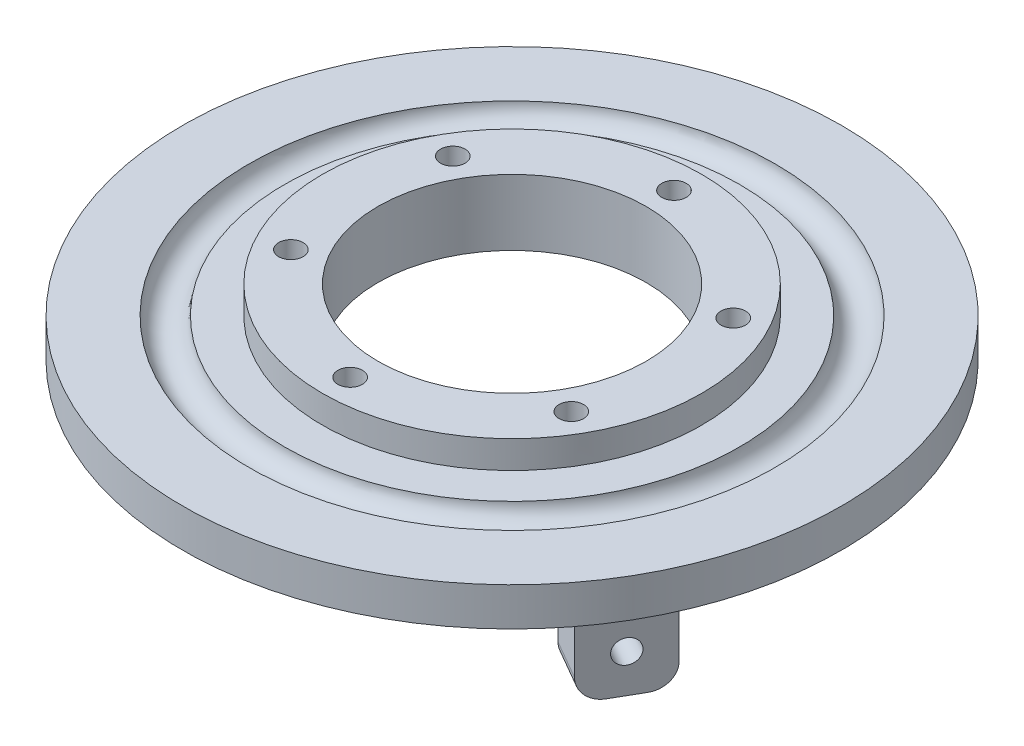
ISO-10303-21;
HEADER;
FILE_DESCRIPTION(('STEP AP214'),'2;1');
FILE_NAME('part.step','',(''),(''),'','','');
FILE_SCHEMA(('AUTOMOTIVE_DESIGN { 1 0 10303 214 1 1 1 1 }'));
ENDSEC;
DATA;
#1=APPLICATION_CONTEXT('core data for automotive mechanical design processes');
#2=APPLICATION_PROTOCOL_DEFINITION('international standard','automotive_design',2000,#1);
#3=PRODUCT_CONTEXT('',#1,'mechanical');
#4=PRODUCT('Part','Part','',(#3));
#5=PRODUCT_RELATED_PRODUCT_CATEGORY('part','',(#4));
#6=PRODUCT_DEFINITION_FORMATION('','',#4);
#7=PRODUCT_DEFINITION_CONTEXT('part definition',#1,'design');
#8=PRODUCT_DEFINITION('design','',#6,#7);
#9=PRODUCT_DEFINITION_SHAPE('','',#8);
#10=(LENGTH_UNIT() NAMED_UNIT(*) SI_UNIT(.MILLI.,.METRE.));
#11=(NAMED_UNIT(*) PLANE_ANGLE_UNIT() SI_UNIT($,.RADIAN.));
#12=(NAMED_UNIT(*) SI_UNIT($,.STERADIAN.) SOLID_ANGLE_UNIT());
#13=UNCERTAINTY_MEASURE_WITH_UNIT(LENGTH_MEASURE(1.E-05),#10,'distance_accuracy_value','');
#14=(GEOMETRIC_REPRESENTATION_CONTEXT(3) GLOBAL_UNCERTAINTY_ASSIGNED_CONTEXT((#13)) GLOBAL_UNIT_ASSIGNED_CONTEXT((#10,
#11,#12)) REPRESENTATION_CONTEXT('',''));
#15=CARTESIAN_POINT('',(0.,0.,0.));
#16=DIRECTION('',(0.,0.,1.));
#17=DIRECTION('',(1.,0.,0.));
#18=AXIS2_PLACEMENT_3D('',#15,#16,#17);
#19=CARTESIAN_POINT('',(0.,5.,0.));
#20=DIRECTION('',(0.,-1.,0.));
#21=DIRECTION('',(0.,0.,-1.));
#22=AXIS2_PLACEMENT_3D('',#19,#20,#21);
#23=PLANE('',#22);
#24=CARTESIAN_POINT('',(0.,5.,0.));
#25=DIRECTION('',(0.,-1.,0.));
#26=DIRECTION('',(0.,0.,-1.));
#27=AXIS2_PLACEMENT_3D('',#24,#25,#26);
#28=CIRCLE('',#27,24.75);
#29=CARTESIAN_POINT('',(0.,5.,-24.75));
#30=VERTEX_POINT('',#29);
#31=EDGE_CURVE('E350',#30,#30,#28,.F.);
#32=ORIENTED_EDGE('',*,*,#31,.F.);
#33=EDGE_LOOP('',(#32));
#34=FACE_BOUND('',#33,.T.);
#35=CARTESIAN_POINT('',(0.,5.,0.));
#36=DIRECTION('',(0.,-1.,0.));
#37=DIRECTION('',(0.,0.,-1.));
#38=AXIS2_PLACEMENT_3D('',#35,#36,#37);
#39=CIRCLE('',#38,29.6771515331387);
#40=CARTESIAN_POINT('',(0.,5.,-29.6771515331387));
#41=VERTEX_POINT('',#40);
#42=EDGE_CURVE('E346',#41,#41,#39,.T.);
#43=ORIENTED_EDGE('',*,*,#42,.F.);
#44=EDGE_LOOP('',(#43));
#45=FACE_BOUND('',#44,.T.);
#46=ADVANCED_FACE('F45',(#34,#45),#23,.F.);
#47=CARTESIAN_POINT('',(0.,5.1,0.));
#48=DIRECTION('',(0.,-1.,0.));
#49=DIRECTION('',(0.,0.,-1.));
#50=AXIS2_PLACEMENT_3D('',#47,#48,#49);
#51=TOROIDAL_SURFACE('',#50,32.,2.325);
#52=CARTESIAN_POINT('',(0.,5.,0.));
#53=DIRECTION('',(0.,-1.,0.));
#54=DIRECTION('',(0.,0.,-1.));
#55=AXIS2_PLACEMENT_3D('',#52,#53,#54);
#56=CIRCLE('',#55,34.3228484668613);
#57=CARTESIAN_POINT('',(0.,5.,-34.3228484668613));
#58=VERTEX_POINT('',#57);
#59=EDGE_CURVE('E342',#58,#58,#56,.T.);
#60=ORIENTED_EDGE('',*,*,#59,.F.);
#61=EDGE_LOOP('',(#60));
#62=FACE_BOUND('',#61,.T.);
#63=ORIENTED_EDGE('',*,*,#42,.T.);
#64=EDGE_LOOP('',(#63));
#65=FACE_BOUND('',#64,.T.);
#66=ADVANCED_FACE('F499',(#62,#65),#51,.F.);
#67=CARTESIAN_POINT('',(-34.3228484668613,5.,0.));
#68=DIRECTION('',(0.,-1.,0.));
#69=DIRECTION('',(0.,0.,-1.));
#70=AXIS2_PLACEMENT_3D('',#67,#68,#69);
#71=PLANE('',#70);
#72=CARTESIAN_POINT('',(0.,4.99999999999999,0.));
#73=DIRECTION('',(0.,-1.,0.));
#74=DIRECTION('',(0.,0.,-1.));
#75=AXIS2_PLACEMENT_3D('',#72,#73,#74);
#76=CIRCLE('',#75,43.);
#77=CARTESIAN_POINT('',(0.,4.99999999999999,-43.));
#78=VERTEX_POINT('',#77);
#79=EDGE_CURVE('E338',#78,#78,#76,.T.);
#80=ORIENTED_EDGE('',*,*,#79,.F.);
#81=EDGE_LOOP('',(#80));
#82=FACE_BOUND('',#81,.T.);
#83=ORIENTED_EDGE('',*,*,#59,.T.);
#84=EDGE_LOOP('',(#83));
#85=FACE_BOUND('',#84,.T.);
#86=ADVANCED_FACE('F507',(#82,#85),#71,.F.);
#87=CARTESIAN_POINT('',(0.,0.,0.));
#88=DIRECTION('',(0.,-1.,0.));
#89=DIRECTION('',(0.,0.,-1.));
#90=AXIS2_PLACEMENT_3D('',#87,#88,#89);
#91=CYLINDRICAL_SURFACE('',#90,43.);
#92=CARTESIAN_POINT('',(0.,0.,0.));
#93=DIRECTION('',(0.,-1.,0.));
#94=DIRECTION('',(0.,0.,-1.));
#95=AXIS2_PLACEMENT_3D('',#92,#93,#94);
#96=CIRCLE('',#95,43.);
#97=CARTESIAN_POINT('',(0.,0.,-43.));
#98=VERTEX_POINT('',#97);
#99=EDGE_CURVE('E334',#98,#98,#96,.T.);
#100=ORIENTED_EDGE('',*,*,#99,.F.);
#101=EDGE_LOOP('',(#100));
#102=FACE_BOUND('',#101,.T.);
#103=ORIENTED_EDGE('',*,*,#79,.T.);
#104=EDGE_LOOP('',(#103));
#105=FACE_BOUND('',#104,.T.);
#106=ADVANCED_FACE('F631',(#102,#105),#91,.T.);
#107=CARTESIAN_POINT('',(0.,0.,0.));
#108=DIRECTION('',(0.,1.,0.));
#109=DIRECTION('',(0.,0.,1.));
#110=AXIS2_PLACEMENT_3D('',#107,#108,#109);
#111=PLANE('',#110);
#112=DIRECTION('',(0.500000000000004,0.,0.866025403784436));
#113=VECTOR('',#112,1.);
#114=CARTESIAN_POINT('',(-32.9204390147834,0.,24.7801270189224));
#115=LINE('',#114,#113);
#116=CARTESIAN_POINT('',(-37.9204390147835,0.,16.119872981078));
#117=VERTEX_POINT('',#116);
#118=CARTESIAN_POINT('',(-32.9204390147834,0.,24.7801270189224));
#119=VERTEX_POINT('',#118);
#120=EDGE_CURVE('E203',#117,#119,#115,.T.);
#121=ORIENTED_EDGE('',*,*,#120,.T.);
#122=DIRECTION('',(0.866025403784437,0.,-0.500000000000003));
#123=VECTOR('',#122,1.);
#124=CARTESIAN_POINT('',(-27.8108891324553,0.,21.8301270189223));
#125=LINE('',#124,#123);
#126=CARTESIAN_POINT('',(-27.8108891324553,0.,21.8301270189223));
#127=VERTEX_POINT('',#126);
#128=EDGE_CURVE('E181',#119,#127,#125,.T.);
#129=ORIENTED_EDGE('',*,*,#128,.T.);
#130=DIRECTION('',(-0.500000000000004,0.,-0.866025403784436));
#131=VECTOR('',#130,1.);
#132=CARTESIAN_POINT('',(-27.8108891324553,0.,21.8301270189223));
#133=LINE('',#132,#131);
#134=CARTESIAN_POINT('',(-32.8108891324553,0.,13.169872981078));
#135=VERTEX_POINT('',#134);
#136=EDGE_CURVE('E191',#127,#135,#133,.T.);
#137=ORIENTED_EDGE('',*,*,#136,.T.);
#138=DIRECTION('',(-0.866025403784437,0.,0.500000000000003));
#139=VECTOR('',#138,1.);
#140=CARTESIAN_POINT('',(-32.8108891324553,0.,13.169872981078));
#141=LINE('',#140,#139);
#142=EDGE_CURVE('E198',#135,#117,#141,.T.);
#143=ORIENTED_EDGE('',*,*,#142,.T.);
#144=EDGE_LOOP('',(#121,#129,#137,#143));
#145=FACE_BOUND('',#144,.T.);
#146=DIRECTION('',(0.499999999999992,0.,-0.866025403784443));
#147=VECTOR('',#146,1.);
#148=CARTESIAN_POINT('',(37.9204390147837,0.,16.1198729810775));
#149=LINE('',#148,#147);
#150=CARTESIAN_POINT('',(32.9204390147838,0.,24.7801270189219));
#151=VERTEX_POINT('',#150);
#152=CARTESIAN_POINT('',(37.9204390147837,0.,16.1198729810775));
#153=VERTEX_POINT('',#152);
#154=EDGE_CURVE('E232',#151,#153,#149,.T.);
#155=ORIENTED_EDGE('',*,*,#154,.T.);
#156=DIRECTION('',(-0.866025403784443,0.,-0.499999999999993));
#157=VECTOR('',#156,1.);
#158=CARTESIAN_POINT('',(32.8108891324555,0.,13.1698729810775));
#159=LINE('',#158,#157);
#160=CARTESIAN_POINT('',(32.8108891324555,0.,13.1698729810775));
#161=VERTEX_POINT('',#160);
#162=EDGE_CURVE('E236',#153,#161,#159,.T.);
#163=ORIENTED_EDGE('',*,*,#162,.T.);
#164=DIRECTION('',(-0.499999999999992,0.,0.866025403784443));
#165=VECTOR('',#164,1.);
#166=CARTESIAN_POINT('',(32.8108891324555,0.,13.1698729810775));
#167=LINE('',#166,#165);
#168=CARTESIAN_POINT('',(27.8108891324556,0.,21.8301270189219));
#169=VERTEX_POINT('',#168);
#170=EDGE_CURVE('E240',#161,#169,#167,.T.);
#171=ORIENTED_EDGE('',*,*,#170,.T.);
#172=DIRECTION('',(0.866025403784443,0.,0.499999999999993));
#173=VECTOR('',#172,1.);
#174=CARTESIAN_POINT('',(27.8108891324556,0.,21.8301270189219));
#175=LINE('',#174,#173);
#176=EDGE_CURVE('E245',#169,#151,#175,.T.);
#177=ORIENTED_EDGE('',*,*,#176,.T.);
#178=EDGE_LOOP('',(#155,#163,#171,#177));
#179=FACE_BOUND('',#178,.T.);
#180=DIRECTION('',(-1.,0.,0.));
#181=VECTOR('',#180,1.);
#182=CARTESIAN_POINT('',(-5.,0.,-40.9));
#183=LINE('',#182,#181);
#184=CARTESIAN_POINT('',(5.,0.,-40.9));
#185=VERTEX_POINT('',#184);
#186=CARTESIAN_POINT('',(-5.,0.,-40.9));
#187=VERTEX_POINT('',#186);
#188=EDGE_CURVE('E269',#185,#187,#183,.T.);
#189=ORIENTED_EDGE('',*,*,#188,.T.);
#190=DIRECTION('',(0.,0.,1.));
#191=VECTOR('',#190,1.);
#192=CARTESIAN_POINT('',(-5.00000000000001,0.,-35.));
#193=LINE('',#192,#191);
#194=CARTESIAN_POINT('',(-5.00000000000001,0.,-35.));
#195=VERTEX_POINT('',#194);
#196=EDGE_CURVE('E263',#187,#195,#193,.T.);
#197=ORIENTED_EDGE('',*,*,#196,.T.);
#198=DIRECTION('',(1.,0.,0.));
#199=VECTOR('',#198,1.);
#200=CARTESIAN_POINT('',(-5.00000000000001,0.,-35.));
#201=LINE('',#200,#199);
#202=CARTESIAN_POINT('',(4.99999999999999,0.,-35.));
#203=VERTEX_POINT('',#202);
#204=EDGE_CURVE('E277',#195,#203,#201,.T.);
#205=ORIENTED_EDGE('',*,*,#204,.T.);
#206=DIRECTION('',(0.,0.,-1.));
#207=VECTOR('',#206,1.);
#208=CARTESIAN_POINT('',(4.99999999999999,0.,-35.));
#209=LINE('',#208,#207);
#210=EDGE_CURVE('E281',#203,#185,#209,.T.);
#211=ORIENTED_EDGE('',*,*,#210,.T.);
#212=EDGE_LOOP('',(#189,#197,#205,#211));
#213=FACE_BOUND('',#212,.T.);
#214=CARTESIAN_POINT('',(0.,0.,-21.125));
#215=DIRECTION('',(0.,1.,0.));
#216=DIRECTION('',(0.,0.,1.));
#217=AXIS2_PLACEMENT_3D('',#214,#215,#216);
#218=CIRCLE('',#217,1.6);
#219=CARTESIAN_POINT('',(0.,0.,-19.525));
#220=VERTEX_POINT('',#219);
#221=EDGE_CURVE('E300',#220,#220,#218,.T.);
#222=ORIENTED_EDGE('',*,*,#221,.T.);
#223=EDGE_LOOP('',(#222));
#224=FACE_BOUND('',#223,.T.);
#225=CARTESIAN_POINT('',(-18.2947866549463,0.,-10.5625));
#226=DIRECTION('',(0.,1.,0.));
#227=DIRECTION('',(0.,0.,1.));
#228=AXIS2_PLACEMENT_3D('',#225,#226,#227);
#229=CIRCLE('',#228,1.6);
#230=CARTESIAN_POINT('',(-18.2947866549463,0.,-8.96250000000001));
#231=VERTEX_POINT('',#230);
#232=EDGE_CURVE('E291',#231,#231,#229,.T.);
#233=ORIENTED_EDGE('',*,*,#232,.T.);
#234=EDGE_LOOP('',(#233));
#235=FACE_BOUND('',#234,.T.);
#236=CARTESIAN_POINT('',(-18.2947866549463,0.,10.5625));
#237=DIRECTION('',(0.,1.,0.));
#238=DIRECTION('',(0.,0.,1.));
#239=AXIS2_PLACEMENT_3D('',#236,#237,#238);
#240=CIRCLE('',#239,1.6);
#241=CARTESIAN_POINT('',(-18.2947866549463,0.,12.1625));
#242=VERTEX_POINT('',#241);
#243=EDGE_CURVE('E309',#242,#242,#240,.T.);
#244=ORIENTED_EDGE('',*,*,#243,.T.);
#245=EDGE_LOOP('',(#244));
#246=FACE_BOUND('',#245,.T.);
#247=CARTESIAN_POINT('',(0.,0.,21.125));
#248=DIRECTION('',(0.,1.,0.));
#249=DIRECTION('',(0.,0.,1.));
#250=AXIS2_PLACEMENT_3D('',#247,#248,#249);
#251=CIRCLE('',#250,1.6);
#252=CARTESIAN_POINT('',(0.,0.,22.725));
#253=VERTEX_POINT('',#252);
#254=EDGE_CURVE('E317',#253,#253,#251,.T.);
#255=ORIENTED_EDGE('',*,*,#254,.T.);
#256=EDGE_LOOP('',(#255));
#257=FACE_BOUND('',#256,.T.);
#258=CARTESIAN_POINT('',(18.2947866549463,0.,10.5625));
#259=DIRECTION('',(0.,1.,0.));
#260=DIRECTION('',(0.,0.,1.));
#261=AXIS2_PLACEMENT_3D('',#258,#259,#260);
#262=CIRCLE('',#261,1.6);
#263=CARTESIAN_POINT('',(18.2947866549463,0.,12.1625));
#264=VERTEX_POINT('',#263);
#265=EDGE_CURVE('E313',#264,#264,#262,.T.);
#266=ORIENTED_EDGE('',*,*,#265,.T.);
#267=EDGE_LOOP('',(#266));
#268=FACE_BOUND('',#267,.T.);
#269=CARTESIAN_POINT('',(18.2947866549463,0.,-10.5625));
#270=DIRECTION('',(0.,1.,0.));
#271=DIRECTION('',(0.,0.,1.));
#272=AXIS2_PLACEMENT_3D('',#269,#270,#271);
#273=CIRCLE('',#272,1.6);
#274=CARTESIAN_POINT('',(18.2947866549463,0.,-8.96250000000001));
#275=VERTEX_POINT('',#274);
#276=EDGE_CURVE('E305',#275,#275,#273,.T.);
#277=ORIENTED_EDGE('',*,*,#276,.T.);
#278=EDGE_LOOP('',(#277));
#279=FACE_BOUND('',#278,.T.);
#280=CARTESIAN_POINT('',(0.,0.,0.));
#281=DIRECTION('',(0.,1.,0.));
#282=DIRECTION('',(0.,0.,1.));
#283=AXIS2_PLACEMENT_3D('',#280,#281,#282);
#284=CIRCLE('',#283,17.5);
#285=CARTESIAN_POINT('',(0.,0.,17.5));
#286=VERTEX_POINT('',#285);
#287=EDGE_CURVE('E324',#286,#286,#284,.T.);
#288=ORIENTED_EDGE('',*,*,#287,.T.);
#289=EDGE_LOOP('',(#288));
#290=FACE_BOUND('',#289,.T.);
#291=ORIENTED_EDGE('',*,*,#99,.T.);
#292=EDGE_LOOP('',(#291));
#293=FACE_BOUND('',#292,.T.);
#294=ADVANCED_FACE('F200',(#145,#179,#213,#224,#235,#246,#257,#268,#279,#290,#293),#111,.F.);
#295=CARTESIAN_POINT('',(0.,8.6,0.));
#296=DIRECTION('',(0.,-1.,0.));
#297=DIRECTION('',(0.,0.,-1.));
#298=AXIS2_PLACEMENT_3D('',#295,#296,#297);
#299=CYLINDRICAL_SURFACE('',#298,24.75);
#300=CARTESIAN_POINT('',(0.,8.6,0.));
#301=DIRECTION('',(0.,1.,0.));
#302=DIRECTION('',(0.,0.,1.));
#303=AXIS2_PLACEMENT_3D('',#300,#301,#302);
#304=CIRCLE('',#303,24.75);
#305=CARTESIAN_POINT('',(0.,8.6,24.75));
#306=VERTEX_POINT('',#305);
#307=EDGE_CURVE('E330',#306,#306,#304,.T.);
#308=ORIENTED_EDGE('',*,*,#307,.F.);
#309=EDGE_LOOP('',(#308));
#310=FACE_BOUND('',#309,.T.);
#311=ORIENTED_EDGE('',*,*,#31,.T.);
#312=EDGE_LOOP('',(#311));
#313=FACE_BOUND('',#312,.T.);
#314=ADVANCED_FACE('F625',(#310,#313),#299,.T.);
#315=CARTESIAN_POINT('',(0.,8.6,0.));
#316=DIRECTION('',(0.,1.,0.));
#317=DIRECTION('',(0.,0.,1.));
#318=AXIS2_PLACEMENT_3D('',#315,#316,#317);
#319=PLANE('',#318);
#320=CARTESIAN_POINT('',(0.,8.6,-21.125));
#321=DIRECTION('',(0.,1.,0.));
#322=DIRECTION('',(0.,0.,1.));
#323=AXIS2_PLACEMENT_3D('',#320,#321,#322);
#324=CIRCLE('',#323,1.6);
#325=CARTESIAN_POINT('',(0.,8.6,-19.525));
#326=VERTEX_POINT('',#325);
#327=EDGE_CURVE('E329',#326,#326,#324,.T.);
#328=ORIENTED_EDGE('',*,*,#327,.F.);
#329=EDGE_LOOP('',(#328));
#330=FACE_BOUND('',#329,.T.);
#331=CARTESIAN_POINT('',(-18.2947866549463,8.6,-10.5625));
#332=DIRECTION('',(0.,1.,0.));
#333=DIRECTION('',(0.,0.,1.));
#334=AXIS2_PLACEMENT_3D('',#331,#332,#333);
#335=CIRCLE('',#334,1.6);
#336=CARTESIAN_POINT('',(-18.2947866549463,8.6,-8.96250000000001));
#337=VERTEX_POINT('',#336);
#338=EDGE_CURVE('E373',#337,#337,#335,.T.);
#339=ORIENTED_EDGE('',*,*,#338,.F.);
#340=EDGE_LOOP('',(#339));
#341=FACE_BOUND('',#340,.T.);
#342=CARTESIAN_POINT('',(-18.2947866549463,8.6,10.5625));
#343=DIRECTION('',(0.,1.,0.));
#344=DIRECTION('',(0.,0.,1.));
#345=AXIS2_PLACEMENT_3D('',#342,#343,#344);
#346=CIRCLE('',#345,1.6);
#347=CARTESIAN_POINT('',(-18.2947866549463,8.6,12.1625));
#348=VERTEX_POINT('',#347);
#349=EDGE_CURVE('E369',#348,#348,#346,.T.);
#350=ORIENTED_EDGE('',*,*,#349,.F.);
#351=EDGE_LOOP('',(#350));
#352=FACE_BOUND('',#351,.T.);
#353=CARTESIAN_POINT('',(0.,8.6,21.125));
#354=DIRECTION('',(0.,1.,0.));
#355=DIRECTION('',(0.,0.,1.));
#356=AXIS2_PLACEMENT_3D('',#353,#354,#355);
#357=CIRCLE('',#356,1.6);
#358=CARTESIAN_POINT('',(0.,8.6,22.725));
#359=VERTEX_POINT('',#358);
#360=EDGE_CURVE('E365',#359,#359,#357,.T.);
#361=ORIENTED_EDGE('',*,*,#360,.F.);
#362=EDGE_LOOP('',(#361));
#363=FACE_BOUND('',#362,.T.);
#364=CARTESIAN_POINT('',(18.2947866549463,8.6,10.5625));
#365=DIRECTION('',(0.,1.,0.));
#366=DIRECTION('',(0.,0.,1.));
#367=AXIS2_PLACEMENT_3D('',#364,#365,#366);
#368=CIRCLE('',#367,1.6);
#369=CARTESIAN_POINT('',(18.2947866549463,8.6,12.1625));
#370=VERTEX_POINT('',#369);
#371=EDGE_CURVE('E361',#370,#370,#368,.T.);
#372=ORIENTED_EDGE('',*,*,#371,.F.);
#373=EDGE_LOOP('',(#372));
#374=FACE_BOUND('',#373,.T.);
#375=CARTESIAN_POINT('',(18.2947866549463,8.6,-10.5625));
#376=DIRECTION('',(0.,1.,0.));
#377=DIRECTION('',(0.,0.,1.));
#378=AXIS2_PLACEMENT_3D('',#375,#376,#377);
#379=CIRCLE('',#378,1.6);
#380=CARTESIAN_POINT('',(18.2947866549463,8.6,-8.96250000000001));
#381=VERTEX_POINT('',#380);
#382=EDGE_CURVE('E304',#381,#381,#379,.T.);
#383=ORIENTED_EDGE('',*,*,#382,.F.);
#384=EDGE_LOOP('',(#383));
#385=FACE_BOUND('',#384,.T.);
#386=CARTESIAN_POINT('',(0.,8.6,0.));
#387=DIRECTION('',(0.,1.,0.));
#388=DIRECTION('',(0.,0.,1.));
#389=AXIS2_PLACEMENT_3D('',#386,#387,#388);
#390=CIRCLE('',#389,17.5);
#391=CARTESIAN_POINT('',(0.,8.6,17.5));
#392=VERTEX_POINT('',#391);
#393=EDGE_CURVE('E328',#392,#392,#390,.T.);
#394=ORIENTED_EDGE('',*,*,#393,.F.);
#395=EDGE_LOOP('',(#394));
#396=FACE_BOUND('',#395,.T.);
#397=ORIENTED_EDGE('',*,*,#307,.T.);
#398=EDGE_LOOP('',(#397));
#399=FACE_BOUND('',#398,.T.);
#400=ADVANCED_FACE('F621',(#330,#341,#352,#363,#374,#385,#396,#399),#319,.T.);
#401=CARTESIAN_POINT('',(0.,0.,0.));
#402=DIRECTION('',(0.,1.,0.));
#403=DIRECTION('',(0.,0.,1.));
#404=AXIS2_PLACEMENT_3D('',#401,#402,#403);
#405=CYLINDRICAL_SURFACE('',#404,17.5);
#406=ORIENTED_EDGE('',*,*,#393,.T.);
#407=EDGE_LOOP('',(#406));
#408=FACE_BOUND('',#407,.T.);
#409=ORIENTED_EDGE('',*,*,#287,.F.);
#410=EDGE_LOOP('',(#409));
#411=FACE_BOUND('',#410,.T.);
#412=ADVANCED_FACE('F607',(#408,#411),#405,.F.);
#413=CARTESIAN_POINT('',(18.2947866549463,0.,-10.5625));
#414=DIRECTION('',(0.,1.,0.));
#415=DIRECTION('',(0.,0.,1.));
#416=AXIS2_PLACEMENT_3D('',#413,#414,#415);
#417=CYLINDRICAL_SURFACE('',#416,1.6);
#418=ORIENTED_EDGE('',*,*,#382,.T.);
#419=EDGE_LOOP('',(#418));
#420=FACE_BOUND('',#419,.T.);
#421=ORIENTED_EDGE('',*,*,#276,.F.);
#422=EDGE_LOOP('',(#421));
#423=FACE_BOUND('',#422,.T.);
#424=ADVANCED_FACE('F603',(#420,#423),#417,.F.);
#425=CARTESIAN_POINT('',(18.2947866549463,0.,10.5625));
#426=DIRECTION('',(0.,1.,0.));
#427=DIRECTION('',(0.,0.,1.));
#428=AXIS2_PLACEMENT_3D('',#425,#426,#427);
#429=CYLINDRICAL_SURFACE('',#428,1.6);
#430=ORIENTED_EDGE('',*,*,#371,.T.);
#431=EDGE_LOOP('',(#430));
#432=FACE_BOUND('',#431,.T.);
#433=ORIENTED_EDGE('',*,*,#265,.F.);
#434=EDGE_LOOP('',(#433));
#435=FACE_BOUND('',#434,.T.);
#436=ADVANCED_FACE('F606',(#432,#435),#429,.F.);
#437=CARTESIAN_POINT('',(0.,0.,21.125));
#438=DIRECTION('',(0.,1.,0.));
#439=DIRECTION('',(0.,0.,1.));
#440=AXIS2_PLACEMENT_3D('',#437,#438,#439);
#441=CYLINDRICAL_SURFACE('',#440,1.6);
#442=ORIENTED_EDGE('',*,*,#360,.T.);
#443=EDGE_LOOP('',(#442));
#444=FACE_BOUND('',#443,.T.);
#445=ORIENTED_EDGE('',*,*,#254,.F.);
#446=EDGE_LOOP('',(#445));
#447=FACE_BOUND('',#446,.T.);
#448=ADVANCED_FACE('F611',(#444,#447),#441,.F.);
#449=CARTESIAN_POINT('',(-18.2947866549463,0.,10.5625));
#450=DIRECTION('',(0.,1.,0.));
#451=DIRECTION('',(0.,0.,1.));
#452=AXIS2_PLACEMENT_3D('',#449,#450,#451);
#453=CYLINDRICAL_SURFACE('',#452,1.6);
#454=ORIENTED_EDGE('',*,*,#349,.T.);
#455=EDGE_LOOP('',(#454));
#456=FACE_BOUND('',#455,.T.);
#457=ORIENTED_EDGE('',*,*,#243,.F.);
#458=EDGE_LOOP('',(#457));
#459=FACE_BOUND('',#458,.T.);
#460=ADVANCED_FACE('F601',(#456,#459),#453,.F.);
#461=CARTESIAN_POINT('',(-18.2947866549463,0.,-10.5625));
#462=DIRECTION('',(0.,1.,0.));
#463=DIRECTION('',(0.,0.,1.));
#464=AXIS2_PLACEMENT_3D('',#461,#462,#463);
#465=CYLINDRICAL_SURFACE('',#464,1.6);
#466=ORIENTED_EDGE('',*,*,#338,.T.);
#467=EDGE_LOOP('',(#466));
#468=FACE_BOUND('',#467,.T.);
#469=ORIENTED_EDGE('',*,*,#232,.F.);
#470=EDGE_LOOP('',(#469));
#471=FACE_BOUND('',#470,.T.);
#472=ADVANCED_FACE('F597',(#468,#471),#465,.F.);
#473=CARTESIAN_POINT('',(0.,0.,-21.125));
#474=DIRECTION('',(0.,1.,0.));
#475=DIRECTION('',(0.,0.,1.));
#476=AXIS2_PLACEMENT_3D('',#473,#474,#475);
#477=CYLINDRICAL_SURFACE('',#476,1.6);
#478=ORIENTED_EDGE('',*,*,#327,.T.);
#479=EDGE_LOOP('',(#478));
#480=FACE_BOUND('',#479,.T.);
#481=ORIENTED_EDGE('',*,*,#221,.F.);
#482=EDGE_LOOP('',(#481));
#483=FACE_BOUND('',#482,.T.);
#484=ADVANCED_FACE('F593',(#480,#483),#477,.F.);
#485=CARTESIAN_POINT('',(-5.00000000000001,-10.,-35.));
#486=DIRECTION('',(-1.,0.,0.));
#487=DIRECTION('',(0.,0.,1.));
#488=AXIS2_PLACEMENT_3D('',#485,#486,#487);
#489=PLANE('',#488);
#490=DIRECTION('',(0.,1.,0.));
#491=VECTOR('',#490,1.);
#492=CARTESIAN_POINT('',(-5.,-10.,-40.9));
#493=LINE('',#492,#491);
#494=CARTESIAN_POINT('',(-5.,-7.,-40.9));
#495=VERTEX_POINT('',#494);
#496=EDGE_CURVE('E288',#495,#187,#493,.T.);
#497=ORIENTED_EDGE('',*,*,#496,.F.);
#498=DIRECTION('',(0.,0.,1.));
#499=VECTOR('',#498,1.);
#500=CARTESIAN_POINT('',(-5.00000000000001,-7.,-35.));
#501=LINE('',#500,#499);
#502=CARTESIAN_POINT('',(-5.00000000000001,-7.,-35.));
#503=VERTEX_POINT('',#502);
#504=EDGE_CURVE('E354',#495,#503,#501,.T.);
#505=ORIENTED_EDGE('',*,*,#504,.T.);
#506=DIRECTION('',(0.,1.,0.));
#507=VECTOR('',#506,1.);
#508=CARTESIAN_POINT('',(-5.00000000000001,-10.,-35.));
#509=LINE('',#508,#507);
#510=EDGE_CURVE('E273',#503,#195,#509,.T.);
#511=ORIENTED_EDGE('',*,*,#510,.T.);
#512=ORIENTED_EDGE('',*,*,#196,.F.);
#513=EDGE_LOOP('',(#497,#505,#511,#512));
#514=FACE_BOUND('',#513,.T.);
#515=ADVANCED_FACE('F583',(#514),#489,.T.);
#516=CARTESIAN_POINT('',(-5.,-10.,-40.9));
#517=DIRECTION('',(0.,0.,-1.));
#518=DIRECTION('',(-1.,0.,0.));
#519=AXIS2_PLACEMENT_3D('',#516,#517,#518);
#520=PLANE('',#519);
#521=CARTESIAN_POINT('',(0.,-5.,-40.9));
#522=DIRECTION('',(0.,0.,-1.));
#523=DIRECTION('',(-1.,0.,0.));
#524=AXIS2_PLACEMENT_3D('',#521,#522,#523);
#525=CIRCLE('',#524,1.55);
#526=CARTESIAN_POINT('',(-1.55,-5.,-40.9));
#527=VERTEX_POINT('',#526);
#528=EDGE_CURVE('E259',#527,#527,#525,.T.);
#529=ORIENTED_EDGE('',*,*,#528,.F.);
#530=EDGE_LOOP('',(#529));
#531=FACE_BOUND('',#530,.T.);
#532=DIRECTION('',(-1.,0.,0.));
#533=VECTOR('',#532,1.);
#534=CARTESIAN_POINT('',(-5.,-10.,-40.9));
#535=LINE('',#534,#533);
#536=CARTESIAN_POINT('',(2.,-10.,-40.9));
#537=VERTEX_POINT('',#536);
#538=CARTESIAN_POINT('',(-2.,-10.,-40.9));
#539=VERTEX_POINT('',#538);
#540=EDGE_CURVE('E268',#537,#539,#535,.T.);
#541=ORIENTED_EDGE('',*,*,#540,.T.);
#542=CARTESIAN_POINT('',(-2.,-7.,-40.9));
#543=DIRECTION('',(0.,0.,-1.));
#544=DIRECTION('',(-1.,0.,0.));
#545=AXIS2_PLACEMENT_3D('',#542,#543,#544);
#546=CIRCLE('',#545,3.);
#547=EDGE_CURVE('E398',#539,#495,#546,.T.);
#548=ORIENTED_EDGE('',*,*,#547,.T.);
#549=ORIENTED_EDGE('',*,*,#496,.T.);
#550=ORIENTED_EDGE('',*,*,#188,.F.);
#551=DIRECTION('',(0.,1.,0.));
#552=VECTOR('',#551,1.);
#553=CARTESIAN_POINT('',(5.,-10.,-40.9));
#554=LINE('',#553,#552);
#555=CARTESIAN_POINT('',(5.,-7.,-40.9));
#556=VERTEX_POINT('',#555);
#557=EDGE_CURVE('E292',#556,#185,#554,.T.);
#558=ORIENTED_EDGE('',*,*,#557,.F.);
#559=CARTESIAN_POINT('',(2.,-7.,-40.9));
#560=DIRECTION('',(0.,0.,-1.));
#561=DIRECTION('',(-1.,0.,0.));
#562=AXIS2_PLACEMENT_3D('',#559,#560,#561);
#563=CIRCLE('',#562,3.);
#564=EDGE_CURVE('E395',#556,#537,#563,.T.);
#565=ORIENTED_EDGE('',*,*,#564,.T.);
#566=EDGE_LOOP('',(#541,#548,#549,#550,#558,#565));
#567=FACE_BOUND('',#566,.T.);
#568=ADVANCED_FACE('F579',(#531,#567),#520,.T.);
#569=CARTESIAN_POINT('',(4.99999999999999,-10.,-35.));
#570=DIRECTION('',(1.,0.,0.));
#571=DIRECTION('',(0.,0.,-1.));
#572=AXIS2_PLACEMENT_3D('',#569,#570,#571);
#573=PLANE('',#572);
#574=DIRECTION('',(0.,1.,0.));
#575=VECTOR('',#574,1.);
#576=CARTESIAN_POINT('',(4.99999999999999,-10.,-35.));
#577=LINE('',#576,#575);
#578=CARTESIAN_POINT('',(4.99999999999999,-7.,-35.));
#579=VERTEX_POINT('',#578);
#580=EDGE_CURVE('E295',#579,#203,#577,.T.);
#581=ORIENTED_EDGE('',*,*,#580,.F.);
#582=DIRECTION('',(0.,0.,-1.));
#583=VECTOR('',#582,1.);
#584=CARTESIAN_POINT('',(4.99999999999999,-7.,-35.));
#585=LINE('',#584,#583);
#586=EDGE_CURVE('E401',#579,#556,#585,.T.);
#587=ORIENTED_EDGE('',*,*,#586,.T.);
#588=ORIENTED_EDGE('',*,*,#557,.T.);
#589=ORIENTED_EDGE('',*,*,#210,.F.);
#590=EDGE_LOOP('',(#581,#587,#588,#589));
#591=FACE_BOUND('',#590,.T.);
#592=ADVANCED_FACE('F582',(#591),#573,.T.);
#593=CARTESIAN_POINT('',(-5.00000000000001,-10.,-35.));
#594=DIRECTION('',(0.,0.,1.));
#595=DIRECTION('',(1.,0.,0.));
#596=AXIS2_PLACEMENT_3D('',#593,#594,#595);
#597=PLANE('',#596);
#598=CARTESIAN_POINT('',(0.,-5.,-35.));
#599=DIRECTION('',(0.,0.,1.));
#600=DIRECTION('',(1.,0.,0.));
#601=AXIS2_PLACEMENT_3D('',#598,#599,#600);
#602=CIRCLE('',#601,1.55);
#603=CARTESIAN_POINT('',(1.55,-5.,-35.));
#604=VERTEX_POINT('',#603);
#605=EDGE_CURVE('E221',#604,#604,#602,.T.);
#606=ORIENTED_EDGE('',*,*,#605,.F.);
#607=EDGE_LOOP('',(#606));
#608=FACE_BOUND('',#607,.T.);
#609=ORIENTED_EDGE('',*,*,#510,.F.);
#610=CARTESIAN_POINT('',(-2.00000000000001,-7.,-35.));
#611=DIRECTION('',(0.,0.,1.));
#612=DIRECTION('',(1.,0.,0.));
#613=AXIS2_PLACEMENT_3D('',#610,#611,#612);
#614=CIRCLE('',#613,3.);
#615=CARTESIAN_POINT('',(-2.00000000000001,-10.,-35.));
#616=VERTEX_POINT('',#615);
#617=EDGE_CURVE('E386',#503,#616,#614,.T.);
#618=ORIENTED_EDGE('',*,*,#617,.T.);
#619=DIRECTION('',(1.,0.,0.));
#620=VECTOR('',#619,1.);
#621=CARTESIAN_POINT('',(-5.00000000000001,-10.,-35.));
#622=LINE('',#621,#620);
#623=CARTESIAN_POINT('',(1.99999999999999,-10.,-35.));
#624=VERTEX_POINT('',#623);
#625=EDGE_CURVE('E264',#616,#624,#622,.T.);
#626=ORIENTED_EDGE('',*,*,#625,.T.);
#627=CARTESIAN_POINT('',(1.99999999999999,-7.,-35.));
#628=DIRECTION('',(0.,0.,1.));
#629=DIRECTION('',(1.,0.,0.));
#630=AXIS2_PLACEMENT_3D('',#627,#628,#629);
#631=CIRCLE('',#630,3.);
#632=EDGE_CURVE('E383',#624,#579,#631,.T.);
#633=ORIENTED_EDGE('',*,*,#632,.T.);
#634=ORIENTED_EDGE('',*,*,#580,.T.);
#635=ORIENTED_EDGE('',*,*,#204,.F.);
#636=EDGE_LOOP('',(#609,#618,#626,#633,#634,#635));
#637=FACE_BOUND('',#636,.T.);
#638=ADVANCED_FACE('F577',(#608,#637),#597,.T.);
#639=CARTESIAN_POINT('',(0.,-10.,0.));
#640=DIRECTION('',(0.,-1.,0.));
#641=DIRECTION('',(0.,0.,-1.));
#642=AXIS2_PLACEMENT_3D('',#639,#640,#641);
#643=PLANE('',#642);
#644=ORIENTED_EDGE('',*,*,#625,.F.);
#645=DIRECTION('',(0.,0.,1.));
#646=VECTOR('',#645,1.);
#647=CARTESIAN_POINT('',(-2.00000000000004,-10.,0.));
#648=LINE('',#647,#646);
#649=EDGE_CURVE('E392',#616,#539,#648,.F.);
#650=ORIENTED_EDGE('',*,*,#649,.T.);
#651=ORIENTED_EDGE('',*,*,#540,.F.);
#652=DIRECTION('',(0.,0.,-1.));
#653=VECTOR('',#652,1.);
#654=CARTESIAN_POINT('',(1.99999999999996,-10.,0.));
#655=LINE('',#654,#653);
#656=EDGE_CURVE('E389',#537,#624,#655,.F.);
#657=ORIENTED_EDGE('',*,*,#656,.T.);
#658=EDGE_LOOP('',(#644,#650,#651,#657));
#659=FACE_BOUND('',#658,.T.);
#660=ADVANCED_FACE('F518',(#659),#643,.T.);
#661=CARTESIAN_POINT('',(-2.00000000000001,-7.,-35.));
#662=DIRECTION('',(0.,0.,1.));
#663=DIRECTION('',(1.,0.,0.));
#664=AXIS2_PLACEMENT_3D('',#661,#662,#663);
#665=CYLINDRICAL_SURFACE('',#664,3.);
#666=ORIENTED_EDGE('',*,*,#547,.F.);
#667=ORIENTED_EDGE('',*,*,#649,.F.);
#668=ORIENTED_EDGE('',*,*,#617,.F.);
#669=ORIENTED_EDGE('',*,*,#504,.F.);
#670=EDGE_LOOP('',(#666,#667,#668,#669));
#671=FACE_BOUND('',#670,.T.);
#672=ADVANCED_FACE('F514',(#671),#665,.T.);
#673=CARTESIAN_POINT('',(1.99999999999999,-7.,-35.));
#674=DIRECTION('',(0.,0.,-1.));
#675=DIRECTION('',(-1.,0.,0.));
#676=AXIS2_PLACEMENT_3D('',#673,#674,#675);
#677=CYLINDRICAL_SURFACE('',#676,3.);
#678=ORIENTED_EDGE('',*,*,#632,.F.);
#679=ORIENTED_EDGE('',*,*,#656,.F.);
#680=ORIENTED_EDGE('',*,*,#564,.F.);
#681=ORIENTED_EDGE('',*,*,#586,.F.);
#682=EDGE_LOOP('',(#678,#679,#680,#681));
#683=FACE_BOUND('',#682,.T.);
#684=ADVANCED_FACE('F517',(#683),#677,.T.);
#685=CARTESIAN_POINT('',(0.,-5.,-43.));
#686=DIRECTION('',(0.,0.,1.));
#687=DIRECTION('',(1.,0.,0.));
#688=AXIS2_PLACEMENT_3D('',#685,#686,#687);
#689=CYLINDRICAL_SURFACE('',#688,1.55);
#690=ORIENTED_EDGE('',*,*,#528,.T.);
#691=EDGE_LOOP('',(#690));
#692=FACE_BOUND('',#691,.T.);
#693=ORIENTED_EDGE('',*,*,#605,.T.);
#694=EDGE_LOOP('',(#693));
#695=FACE_BOUND('',#694,.T.);
#696=ADVANCED_FACE('F522',(#692,#695),#689,.F.);
#697=CARTESIAN_POINT('',(32.8108891324555,-10.,13.1698729810775));
#698=DIRECTION('',(0.499999999999993,0.,-0.866025403784443));
#699=DIRECTION('',(-0.866025403784443,0.,-0.499999999999993));
#700=AXIS2_PLACEMENT_3D('',#697,#698,#699);
#701=PLANE('',#700);
#702=DIRECTION('',(0.,1.,0.));
#703=VECTOR('',#702,1.);
#704=CARTESIAN_POINT('',(37.9204390147837,-10.,16.1198729810775));
#705=LINE('',#704,#703);
#706=CARTESIAN_POINT('',(37.9204390147837,-7.,16.1198729810775));
#707=VERTEX_POINT('',#706);
#708=EDGE_CURVE('E205',#707,#153,#705,.T.);
#709=ORIENTED_EDGE('',*,*,#708,.F.);
#710=DIRECTION('',(-0.866025403784443,0.,-0.499999999999993));
#711=VECTOR('',#710,1.);
#712=CARTESIAN_POINT('',(32.8108891324555,-7.,13.1698729810775));
#713=LINE('',#712,#711);
#714=CARTESIAN_POINT('',(32.8108891324555,-7.,13.1698729810775));
#715=VERTEX_POINT('',#714);
#716=EDGE_CURVE('E432',#707,#715,#713,.T.);
#717=ORIENTED_EDGE('',*,*,#716,.T.);
#718=DIRECTION('',(0.,1.,0.));
#719=VECTOR('',#718,1.);
#720=CARTESIAN_POINT('',(32.8108891324555,-10.,13.1698729810775));
#721=LINE('',#720,#719);
#722=EDGE_CURVE('E235',#715,#161,#721,.T.);
#723=ORIENTED_EDGE('',*,*,#722,.T.);
#724=ORIENTED_EDGE('',*,*,#162,.F.);
#725=EDGE_LOOP('',(#709,#717,#723,#724));
#726=FACE_BOUND('',#725,.T.);
#727=ADVANCED_FACE('F542',(#726),#701,.T.);
#728=CARTESIAN_POINT('',(37.9204390147837,-10.,16.1198729810775));
#729=DIRECTION('',(0.866025403784443,0.,0.499999999999992));
#730=DIRECTION('',(0.499999999999992,0.,-0.866025403784443));
#731=AXIS2_PLACEMENT_3D('',#728,#729,#730);
#732=PLANE('',#731);
#733=CARTESIAN_POINT('',(35.4204390147837,-5.,20.4499999999997));
#734=DIRECTION('',(0.866025403784443,0.,0.499999999999992));
#735=DIRECTION('',(0.499999999999992,0.,-0.866025403784443));
#736=AXIS2_PLACEMENT_3D('',#733,#734,#735);
#737=CIRCLE('',#736,1.55);
#738=CARTESIAN_POINT('',(36.1954390147837,-5.,19.1076606241338));
#739=VERTEX_POINT('',#738);
#740=EDGE_CURVE('E241',#739,#739,#737,.T.);
#741=ORIENTED_EDGE('',*,*,#740,.F.);
#742=EDGE_LOOP('',(#741));
#743=FACE_BOUND('',#742,.T.);
#744=DIRECTION('',(0.499999999999992,0.,-0.866025403784443));
#745=VECTOR('',#744,1.);
#746=CARTESIAN_POINT('',(37.9204390147837,-10.,16.1198729810775));
#747=LINE('',#746,#745);
#748=CARTESIAN_POINT('',(34.4204390147838,-10.,22.1820508075686));
#749=VERTEX_POINT('',#748);
#750=CARTESIAN_POINT('',(36.4204390147837,-10.,18.7179491924308));
#751=VERTEX_POINT('',#750);
#752=EDGE_CURVE('E231',#749,#751,#747,.T.);
#753=ORIENTED_EDGE('',*,*,#752,.T.);
#754=CARTESIAN_POINT('',(36.4204390147837,-7.,18.7179491924308));
#755=DIRECTION('',(0.866025403784443,0.,0.499999999999992));
#756=DIRECTION('',(0.499999999999992,0.,-0.866025403784443));
#757=AXIS2_PLACEMENT_3D('',#754,#755,#756);
#758=CIRCLE('',#757,3.);
#759=EDGE_CURVE('E55',#751,#707,#758,.T.);
#760=ORIENTED_EDGE('',*,*,#759,.T.);
#761=ORIENTED_EDGE('',*,*,#708,.T.);
#762=ORIENTED_EDGE('',*,*,#154,.F.);
#763=DIRECTION('',(0.,1.,0.));
#764=VECTOR('',#763,1.);
#765=CARTESIAN_POINT('',(32.9204390147838,-10.,24.7801270189219));
#766=LINE('',#765,#764);
#767=CARTESIAN_POINT('',(32.9204390147838,-7.,24.7801270189219));
#768=VERTEX_POINT('',#767);
#769=EDGE_CURVE('E208',#768,#151,#766,.T.);
#770=ORIENTED_EDGE('',*,*,#769,.F.);
#771=CARTESIAN_POINT('',(34.4204390147838,-7.,22.1820508075686));
#772=DIRECTION('',(0.866025403784443,0.,0.499999999999992));
#773=DIRECTION('',(0.499999999999992,0.,-0.866025403784443));
#774=AXIS2_PLACEMENT_3D('',#771,#772,#773);
#775=CIRCLE('',#774,3.);
#776=EDGE_CURVE('E63',#768,#749,#775,.T.);
#777=ORIENTED_EDGE('',*,*,#776,.T.);
#778=EDGE_LOOP('',(#753,#760,#761,#762,#770,#777));
#779=FACE_BOUND('',#778,.T.);
#780=ADVANCED_FACE('F538',(#743,#779),#732,.T.);
#781=CARTESIAN_POINT('',(27.8108891324556,-10.,21.8301270189219));
#782=DIRECTION('',(-0.499999999999993,0.,0.866025403784443));
#783=DIRECTION('',(0.866025403784443,0.,0.499999999999993));
#784=AXIS2_PLACEMENT_3D('',#781,#782,#783);
#785=PLANE('',#784);
#786=DIRECTION('',(0.,1.,0.));
#787=VECTOR('',#786,1.);
#788=CARTESIAN_POINT('',(27.8108891324556,-10.,21.8301270189219));
#789=LINE('',#788,#787);
#790=CARTESIAN_POINT('',(27.8108891324556,-7.,21.8301270189219));
#791=VERTEX_POINT('',#790);
#792=EDGE_CURVE('E254',#791,#169,#789,.T.);
#793=ORIENTED_EDGE('',*,*,#792,.F.);
#794=DIRECTION('',(0.866025403784443,0.,0.499999999999993));
#795=VECTOR('',#794,1.);
#796=CARTESIAN_POINT('',(27.8108891324556,-7.,21.8301270189219));
#797=LINE('',#796,#795);
#798=EDGE_CURVE('E11',#791,#768,#797,.T.);
#799=ORIENTED_EDGE('',*,*,#798,.T.);
#800=ORIENTED_EDGE('',*,*,#769,.T.);
#801=ORIENTED_EDGE('',*,*,#176,.F.);
#802=EDGE_LOOP('',(#793,#799,#800,#801));
#803=FACE_BOUND('',#802,.T.);
#804=ADVANCED_FACE('F550',(#803),#785,.T.);
#805=CARTESIAN_POINT('',(32.8108891324555,-10.,13.1698729810775));
#806=DIRECTION('',(-0.866025403784443,0.,-0.499999999999992));
#807=DIRECTION('',(-0.499999999999992,0.,0.866025403784443));
#808=AXIS2_PLACEMENT_3D('',#805,#806,#807);
#809=PLANE('',#808);
#810=CARTESIAN_POINT('',(30.3108891324555,-5.,17.4999999999997));
#811=DIRECTION('',(-0.866025403784443,0.,-0.499999999999992));
#812=DIRECTION('',(-0.499999999999992,0.,0.866025403784443));
#813=AXIS2_PLACEMENT_3D('',#810,#811,#812);
#814=CIRCLE('',#813,1.55);
#815=CARTESIAN_POINT('',(29.5358891324555,-5.,18.8423393758656));
#816=VERTEX_POINT('',#815);
#817=EDGE_CURVE('E49',#816,#816,#814,.T.);
#818=ORIENTED_EDGE('',*,*,#817,.F.);
#819=EDGE_LOOP('',(#818));
#820=FACE_BOUND('',#819,.T.);
#821=ORIENTED_EDGE('',*,*,#722,.F.);
#822=CARTESIAN_POINT('',(31.3108891324555,-7.,15.7679491924308));
#823=DIRECTION('',(-0.866025403784443,0.,-0.499999999999992));
#824=DIRECTION('',(-0.499999999999992,0.,0.866025403784443));
#825=AXIS2_PLACEMENT_3D('',#822,#823,#824);
#826=CIRCLE('',#825,3.);
#827=CARTESIAN_POINT('',(31.3108891324555,-10.,15.7679491924308));
#828=VERTEX_POINT('',#827);
#829=EDGE_CURVE('E439',#715,#828,#826,.T.);
#830=ORIENTED_EDGE('',*,*,#829,.T.);
#831=DIRECTION('',(-0.499999999999992,0.,0.866025403784443));
#832=VECTOR('',#831,1.);
#833=CARTESIAN_POINT('',(32.8108891324555,-10.,13.1698729810775));
#834=LINE('',#833,#832);
#835=CARTESIAN_POINT('',(29.3108891324555,-10.,19.2320508075686));
#836=VERTEX_POINT('',#835);
#837=EDGE_CURVE('E227',#828,#836,#834,.T.);
#838=ORIENTED_EDGE('',*,*,#837,.T.);
#839=CARTESIAN_POINT('',(29.3108891324555,-7.,19.2320508075686));
#840=DIRECTION('',(-0.866025403784443,0.,-0.499999999999992));
#841=DIRECTION('',(-0.499999999999992,0.,0.866025403784443));
#842=AXIS2_PLACEMENT_3D('',#839,#840,#841);
#843=CIRCLE('',#842,3.);
#844=EDGE_CURVE('E436',#836,#791,#843,.T.);
#845=ORIENTED_EDGE('',*,*,#844,.T.);
#846=ORIENTED_EDGE('',*,*,#792,.T.);
#847=ORIENTED_EDGE('',*,*,#170,.F.);
#848=EDGE_LOOP('',(#821,#830,#838,#845,#846,#847));
#849=FACE_BOUND('',#848,.T.);
#850=ADVANCED_FACE('F553',(#820,#849),#809,.T.);
#851=CARTESIAN_POINT('',(0.,-10.,0.));
#852=DIRECTION('',(0.,-1.,0.));
#853=DIRECTION('',(0.866025403784443,0.,0.499999999999992));
#854=AXIS2_PLACEMENT_3D('',#851,#852,#853);
#855=PLANE('',#854);
#856=ORIENTED_EDGE('',*,*,#837,.F.);
#857=DIRECTION('',(-0.866025403784443,0.,-0.499999999999993));
#858=VECTOR('',#857,1.);
#859=CARTESIAN_POINT('',(1.00000000000001,-10.,-1.73205080756892));
#860=LINE('',#859,#858);
#861=EDGE_CURVE('E70',#828,#751,#860,.F.);
#862=ORIENTED_EDGE('',*,*,#861,.T.);
#863=ORIENTED_EDGE('',*,*,#752,.F.);
#864=DIRECTION('',(0.866025403784443,0.,0.499999999999993));
#865=VECTOR('',#864,1.);
#866=CARTESIAN_POINT('',(-0.999999999999964,-10.,1.73205080756885));
#867=LINE('',#866,#865);
#868=EDGE_CURVE('E442',#749,#836,#867,.F.);
#869=ORIENTED_EDGE('',*,*,#868,.T.);
#870=EDGE_LOOP('',(#856,#862,#863,#869));
#871=FACE_BOUND('',#870,.T.);
#872=ADVANCED_FACE('F554',(#871),#855,.T.);
#873=CARTESIAN_POINT('',(-27.8108891324553,-10.,21.8301270189223));
#874=DIRECTION('',(0.500000000000003,0.,0.866025403784437));
#875=DIRECTION('',(0.866025403784437,0.,-0.500000000000003));
#876=AXIS2_PLACEMENT_3D('',#873,#874,#875);
#877=PLANE('',#876);
#878=DIRECTION('',(0.,1.,0.));
#879=VECTOR('',#878,1.);
#880=CARTESIAN_POINT('',(-32.9204390147834,-10.,24.7801270189224));
#881=LINE('',#880,#879);
#882=CARTESIAN_POINT('',(-32.9204390147834,-7.,24.7801270189224));
#883=VERTEX_POINT('',#882);
#884=EDGE_CURVE('E218',#883,#119,#881,.T.);
#885=ORIENTED_EDGE('',*,*,#884,.F.);
#886=DIRECTION('',(0.866025403784437,0.,-0.500000000000003));
#887=VECTOR('',#886,1.);
#888=CARTESIAN_POINT('',(-27.8108891324553,-7.,21.8301270189223));
#889=LINE('',#888,#887);
#890=CARTESIAN_POINT('',(-27.8108891324553,-7.,21.8301270189223));
#891=VERTEX_POINT('',#890);
#892=EDGE_CURVE('E184',#883,#891,#889,.T.);
#893=ORIENTED_EDGE('',*,*,#892,.T.);
#894=DIRECTION('',(0.,1.,0.));
#895=VECTOR('',#894,1.);
#896=CARTESIAN_POINT('',(-27.8108891324553,-10.,21.8301270189223));
#897=LINE('',#896,#895);
#898=EDGE_CURVE('E176',#891,#127,#897,.T.);
#899=ORIENTED_EDGE('',*,*,#898,.T.);
#900=ORIENTED_EDGE('',*,*,#128,.F.);
#901=EDGE_LOOP('',(#885,#893,#899,#900));
#902=FACE_BOUND('',#901,.T.);
#903=ADVANCED_FACE('F179',(#902),#877,.T.);
#904=CARTESIAN_POINT('',(-32.9204390147834,-10.,24.7801270189224));
#905=DIRECTION('',(-0.866025403784436,0.,0.500000000000004));
#906=DIRECTION('',(0.500000000000004,0.,0.866025403784436));
#907=AXIS2_PLACEMENT_3D('',#904,#905,#906);
#908=PLANE('',#907);
#909=CARTESIAN_POINT('',(-35.4204390147834,-5.,20.4500000000002));
#910=DIRECTION('',(-0.866025403784436,0.,0.500000000000004));
#911=DIRECTION('',(0.500000000000004,0.,0.866025403784436));
#912=AXIS2_PLACEMENT_3D('',#909,#910,#911);
#913=CIRCLE('',#912,1.55);
#914=CARTESIAN_POINT('',(-34.6454390147834,-5.,21.792339375866));
#915=VERTEX_POINT('',#914);
#916=EDGE_CURVE('E453',#915,#915,#913,.T.);
#917=ORIENTED_EDGE('',*,*,#916,.F.);
#918=EDGE_LOOP('',(#917));
#919=FACE_BOUND('',#918,.T.);
#920=DIRECTION('',(0.500000000000004,0.,0.866025403784436));
#921=VECTOR('',#920,1.);
#922=CARTESIAN_POINT('',(-32.9204390147834,-10.,24.7801270189224));
#923=LINE('',#922,#921);
#924=CARTESIAN_POINT('',(-36.4204390147835,-10.,18.7179491924313));
#925=VERTEX_POINT('',#924);
#926=CARTESIAN_POINT('',(-34.4204390147834,-10.,22.182050807569));
#927=VERTEX_POINT('',#926);
#928=EDGE_CURVE('E188',#925,#927,#923,.T.);
#929=ORIENTED_EDGE('',*,*,#928,.T.);
#930=CARTESIAN_POINT('',(-34.4204390147834,-7.,22.182050807569));
#931=DIRECTION('',(-0.866025403784436,0.,0.500000000000004));
#932=DIRECTION('',(0.500000000000004,0.,0.866025403784436));
#933=AXIS2_PLACEMENT_3D('',#930,#931,#932);
#934=CIRCLE('',#933,3.);
#935=EDGE_CURVE('E425',#927,#883,#934,.T.);
#936=ORIENTED_EDGE('',*,*,#935,.T.);
#937=ORIENTED_EDGE('',*,*,#884,.T.);
#938=ORIENTED_EDGE('',*,*,#120,.F.);
#939=DIRECTION('',(0.,1.,0.));
#940=VECTOR('',#939,1.);
#941=CARTESIAN_POINT('',(-37.9204390147835,-10.,16.119872981078));
#942=LINE('',#941,#940);
#943=CARTESIAN_POINT('',(-37.9204390147835,-7.,16.119872981078));
#944=VERTEX_POINT('',#943);
#945=EDGE_CURVE('E222',#944,#117,#942,.T.);
#946=ORIENTED_EDGE('',*,*,#945,.F.);
#947=CARTESIAN_POINT('',(-36.4204390147835,-7.,18.7179491924313));
#948=DIRECTION('',(-0.866025403784436,0.,0.500000000000004));
#949=DIRECTION('',(0.500000000000004,0.,0.866025403784436));
#950=AXIS2_PLACEMENT_3D('',#947,#948,#949);
#951=CIRCLE('',#950,3.);
#952=EDGE_CURVE('E422',#944,#925,#951,.T.);
#953=ORIENTED_EDGE('',*,*,#952,.T.);
#954=EDGE_LOOP('',(#929,#936,#937,#938,#946,#953));
#955=FACE_BOUND('',#954,.T.);
#956=ADVANCED_FACE('F475',(#919,#955),#908,.T.);
#957=CARTESIAN_POINT('',(-32.8108891324553,-10.,13.169872981078));
#958=DIRECTION('',(-0.500000000000003,0.,-0.866025403784437));
#959=DIRECTION('',(-0.866025403784437,0.,0.500000000000003));
#960=AXIS2_PLACEMENT_3D('',#957,#958,#959);
#961=PLANE('',#960);
#962=DIRECTION('',(0.,1.,0.));
#963=VECTOR('',#962,1.);
#964=CARTESIAN_POINT('',(-32.8108891324553,-10.,13.169872981078));
#965=LINE('',#964,#963);
#966=CARTESIAN_POINT('',(-32.8108891324553,-7.,13.169872981078));
#967=VERTEX_POINT('',#966);
#968=EDGE_CURVE('E187',#967,#135,#965,.T.);
#969=ORIENTED_EDGE('',*,*,#968,.F.);
#970=DIRECTION('',(-0.866025403784437,0.,0.500000000000003));
#971=VECTOR('',#970,1.);
#972=CARTESIAN_POINT('',(-32.8108891324553,-7.,13.169872981078));
#973=LINE('',#972,#971);
#974=EDGE_CURVE('E428',#967,#944,#973,.T.);
#975=ORIENTED_EDGE('',*,*,#974,.T.);
#976=ORIENTED_EDGE('',*,*,#945,.T.);
#977=ORIENTED_EDGE('',*,*,#142,.F.);
#978=EDGE_LOOP('',(#969,#975,#976,#977));
#979=FACE_BOUND('',#978,.T.);
#980=ADVANCED_FACE('F487',(#979),#961,.T.);
#981=CARTESIAN_POINT('',(-27.8108891324553,-10.,21.8301270189223));
#982=DIRECTION('',(0.866025403784436,0.,-0.500000000000004));
#983=DIRECTION('',(-0.500000000000004,0.,-0.866025403784436));
#984=AXIS2_PLACEMENT_3D('',#981,#982,#983);
#985=PLANE('',#984);
#986=CARTESIAN_POINT('',(-30.3108891324553,-5.,17.5000000000001));
#987=DIRECTION('',(0.866025403784436,0.,-0.500000000000004));
#988=DIRECTION('',(-0.500000000000004,0.,-0.866025403784436));
#989=AXIS2_PLACEMENT_3D('',#986,#987,#988);
#990=CIRCLE('',#989,1.55);
#991=CARTESIAN_POINT('',(-31.0858891324553,-5.,16.1576606241343));
#992=VERTEX_POINT('',#991);
#993=EDGE_CURVE('E450',#992,#992,#990,.T.);
#994=ORIENTED_EDGE('',*,*,#993,.F.);
#995=EDGE_LOOP('',(#994));
#996=FACE_BOUND('',#995,.T.);
#997=ORIENTED_EDGE('',*,*,#898,.F.);
#998=CARTESIAN_POINT('',(-29.3108891324553,-7.,19.232050807569));
#999=DIRECTION('',(0.866025403784436,0.,-0.500000000000004));
#1000=DIRECTION('',(-0.500000000000004,0.,-0.866025403784436));
#1001=AXIS2_PLACEMENT_3D('',#998,#999,#1000);
#1002=CIRCLE('',#1001,3.);
#1003=CARTESIAN_POINT('',(-29.3108891324553,-10.,19.232050807569));
#1004=VERTEX_POINT('',#1003);
#1005=EDGE_CURVE('E413',#891,#1004,#1002,.T.);
#1006=ORIENTED_EDGE('',*,*,#1005,.T.);
#1007=DIRECTION('',(-0.500000000000004,0.,-0.866025403784436));
#1008=VECTOR('',#1007,1.);
#1009=CARTESIAN_POINT('',(-27.8108891324553,-10.,21.8301270189223));
#1010=LINE('',#1009,#1008);
#1011=CARTESIAN_POINT('',(-31.3108891324553,-10.,15.7679491924313));
#1012=VERTEX_POINT('',#1011);
#1013=EDGE_CURVE('E217',#1004,#1012,#1010,.T.);
#1014=ORIENTED_EDGE('',*,*,#1013,.T.);
#1015=CARTESIAN_POINT('',(-31.3108891324553,-7.,15.7679491924313));
#1016=DIRECTION('',(0.866025403784436,0.,-0.500000000000004));
#1017=DIRECTION('',(-0.500000000000004,0.,-0.866025403784436));
#1018=AXIS2_PLACEMENT_3D('',#1015,#1016,#1017);
#1019=CIRCLE('',#1018,3.);
#1020=EDGE_CURVE('E410',#1012,#967,#1019,.T.);
#1021=ORIENTED_EDGE('',*,*,#1020,.T.);
#1022=ORIENTED_EDGE('',*,*,#968,.T.);
#1023=ORIENTED_EDGE('',*,*,#136,.F.);
#1024=EDGE_LOOP('',(#997,#1006,#1014,#1021,#1022,#1023));
#1025=FACE_BOUND('',#1024,.T.);
#1026=ADVANCED_FACE('F192',(#996,#1025),#985,.T.);
#1027=CARTESIAN_POINT('',(0.,-10.,0.));
#1028=DIRECTION('',(0.,-1.,0.));
#1029=DIRECTION('',(-0.866025403784436,0.,0.500000000000004));
#1030=AXIS2_PLACEMENT_3D('',#1027,#1028,#1029);
#1031=PLANE('',#1030);
#1032=ORIENTED_EDGE('',*,*,#1013,.F.);
#1033=DIRECTION('',(0.866025403784437,0.,-0.500000000000003));
#1034=VECTOR('',#1033,1.);
#1035=CARTESIAN_POINT('',(1.00000000000003,-10.,1.73205080756891));
#1036=LINE('',#1035,#1034);
#1037=EDGE_CURVE('E419',#1004,#927,#1036,.F.);
#1038=ORIENTED_EDGE('',*,*,#1037,.T.);
#1039=ORIENTED_EDGE('',*,*,#928,.F.);
#1040=DIRECTION('',(-0.866025403784437,0.,0.500000000000003));
#1041=VECTOR('',#1040,1.);
#1042=CARTESIAN_POINT('',(-0.999999999999987,-10.,-1.73205080756884));
#1043=LINE('',#1042,#1041);
#1044=EDGE_CURVE('E416',#925,#1012,#1043,.F.);
#1045=ORIENTED_EDGE('',*,*,#1044,.T.);
#1046=EDGE_LOOP('',(#1032,#1038,#1039,#1045));
#1047=FACE_BOUND('',#1046,.T.);
#1048=ADVANCED_FACE('F482',(#1047),#1031,.T.);
#1049=CARTESIAN_POINT('',(-29.3108891324553,-7.,19.232050807569));
#1050=DIRECTION('',(0.866025403784437,0.,-0.500000000000003));
#1051=DIRECTION('',(-0.500000000000003,0.,-0.866025403784437));
#1052=AXIS2_PLACEMENT_3D('',#1049,#1050,#1051);
#1053=CYLINDRICAL_SURFACE('',#1052,3.);
#1054=ORIENTED_EDGE('',*,*,#935,.F.);
#1055=ORIENTED_EDGE('',*,*,#1037,.F.);
#1056=ORIENTED_EDGE('',*,*,#1005,.F.);
#1057=ORIENTED_EDGE('',*,*,#892,.F.);
#1058=EDGE_LOOP('',(#1054,#1055,#1056,#1057));
#1059=FACE_BOUND('',#1058,.T.);
#1060=ADVANCED_FACE('F481',(#1059),#1053,.T.);
#1061=CARTESIAN_POINT('',(-31.3108891324553,-7.,15.7679491924313));
#1062=DIRECTION('',(-0.866025403784437,0.,0.500000000000003));
#1063=DIRECTION('',(0.500000000000003,0.,0.866025403784437));
#1064=AXIS2_PLACEMENT_3D('',#1061,#1062,#1063);
#1065=CYLINDRICAL_SURFACE('',#1064,3.);
#1066=ORIENTED_EDGE('',*,*,#1020,.F.);
#1067=ORIENTED_EDGE('',*,*,#1044,.F.);
#1068=ORIENTED_EDGE('',*,*,#952,.F.);
#1069=ORIENTED_EDGE('',*,*,#974,.F.);
#1070=EDGE_LOOP('',(#1066,#1067,#1068,#1069));
#1071=FACE_BOUND('',#1070,.T.);
#1072=ADVANCED_FACE('F484',(#1071),#1065,.T.);
#1073=CARTESIAN_POINT('',(31.3108891324555,-7.,15.7679491924308));
#1074=DIRECTION('',(-0.866025403784443,0.,-0.499999999999993));
#1075=DIRECTION('',(-0.499999999999993,0.,0.866025403784443));
#1076=AXIS2_PLACEMENT_3D('',#1073,#1074,#1075);
#1077=CYLINDRICAL_SURFACE('',#1076,3.);
#1078=ORIENTED_EDGE('',*,*,#759,.F.);
#1079=ORIENTED_EDGE('',*,*,#861,.F.);
#1080=ORIENTED_EDGE('',*,*,#829,.F.);
#1081=ORIENTED_EDGE('',*,*,#716,.F.);
#1082=EDGE_LOOP('',(#1078,#1079,#1080,#1081));
#1083=FACE_BOUND('',#1082,.T.);
#1084=ADVANCED_FACE('F527',(#1083),#1077,.T.);
#1085=CARTESIAN_POINT('',(29.3108891324555,-7.,19.2320508075686));
#1086=DIRECTION('',(0.866025403784443,0.,0.499999999999993));
#1087=DIRECTION('',(0.499999999999993,0.,-0.866025403784443));
#1088=AXIS2_PLACEMENT_3D('',#1085,#1086,#1087);
#1089=CYLINDRICAL_SURFACE('',#1088,3.);
#1090=ORIENTED_EDGE('',*,*,#844,.F.);
#1091=ORIENTED_EDGE('',*,*,#868,.F.);
#1092=ORIENTED_EDGE('',*,*,#776,.F.);
#1093=ORIENTED_EDGE('',*,*,#798,.F.);
#1094=EDGE_LOOP('',(#1090,#1091,#1092,#1093));
#1095=FACE_BOUND('',#1094,.T.);
#1096=ADVANCED_FACE('F47',(#1095),#1089,.T.);
#1097=CARTESIAN_POINT('',(-50.8695461813654,-5.,29.3695461813657));
#1098=DIRECTION('',(0.866025403784436,0.,-0.500000000000004));
#1099=DIRECTION('',(-0.500000000000004,0.,-0.866025403784436));
#1100=AXIS2_PLACEMENT_3D('',#1097,#1098,#1099);
#1101=CYLINDRICAL_SURFACE('',#1100,1.55);
#1102=ORIENTED_EDGE('',*,*,#916,.T.);
#1103=EDGE_LOOP('',(#1102));
#1104=FACE_BOUND('',#1103,.T.);
#1105=ORIENTED_EDGE('',*,*,#993,.T.);
#1106=EDGE_LOOP('',(#1105));
#1107=FACE_BOUND('',#1106,.T.);
#1108=ADVANCED_FACE('F533',(#1104,#1107),#1101,.F.);
#1109=CARTESIAN_POINT('',(50.8695461813656,-5.,29.3695461813649));
#1110=DIRECTION('',(-0.866025403784443,0.,-0.499999999999992));
#1111=DIRECTION('',(-0.499999999999992,0.,0.866025403784443));
#1112=AXIS2_PLACEMENT_3D('',#1109,#1110,#1111);
#1113=CYLINDRICAL_SURFACE('',#1112,1.55);
#1114=ORIENTED_EDGE('',*,*,#740,.T.);
#1115=EDGE_LOOP('',(#1114));
#1116=FACE_BOUND('',#1115,.T.);
#1117=ORIENTED_EDGE('',*,*,#817,.T.);
#1118=EDGE_LOOP('',(#1117));
#1119=FACE_BOUND('',#1118,.T.);
#1120=ADVANCED_FACE('F848',(#1116,#1119),#1113,.F.);
#1121=CLOSED_SHELL('',(#46,#66,#86,#106,#294,#314,#400,#412,#424,#436,#448,#460,#472,#484,#515,
#568,#592,#638,#660,#672,#684,#696,#727,#780,#804,#850,#872,#903,#956,#980,#1026,#1048,#1060,
#1072,#1084,#1096,#1108,#1120));
#1122=MANIFOLD_SOLID_BREP('B2',#1121);
#1123=ADVANCED_BREP_SHAPE_REPRESENTATION('',(#18,#1122),#14);
#1124=SHAPE_DEFINITION_REPRESENTATION(#9,#1123);
ENDSEC;
END-ISO-10303-21;
